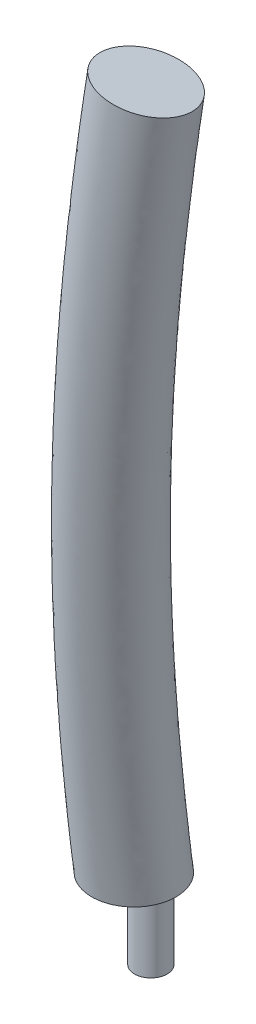
ISO-10303-21;
HEADER;
FILE_DESCRIPTION(('STEP AP214'),'2;1');
FILE_NAME('part.step','',(''),(''),'','','');
FILE_SCHEMA(('AUTOMOTIVE_DESIGN { 1 0 10303 214 1 1 1 1 }'));
ENDSEC;
DATA;
#1=APPLICATION_CONTEXT('core data for automotive mechanical design processes');
#2=APPLICATION_PROTOCOL_DEFINITION('international standard','automotive_design',2000,#1);
#3=PRODUCT_CONTEXT('',#1,'mechanical');
#4=PRODUCT('Part','Part','',(#3));
#5=PRODUCT_RELATED_PRODUCT_CATEGORY('part','',(#4));
#6=PRODUCT_DEFINITION_FORMATION('','',#4);
#7=PRODUCT_DEFINITION_CONTEXT('part definition',#1,'design');
#8=PRODUCT_DEFINITION('design','',#6,#7);
#9=PRODUCT_DEFINITION_SHAPE('','',#8);
#10=(LENGTH_UNIT() NAMED_UNIT(*) SI_UNIT(.MILLI.,.METRE.));
#11=(NAMED_UNIT(*) PLANE_ANGLE_UNIT() SI_UNIT($,.RADIAN.));
#12=(NAMED_UNIT(*) SI_UNIT($,.STERADIAN.) SOLID_ANGLE_UNIT());
#13=UNCERTAINTY_MEASURE_WITH_UNIT(LENGTH_MEASURE(1.E-05),#10,'distance_accuracy_value','');
#14=(GEOMETRIC_REPRESENTATION_CONTEXT(3) GLOBAL_UNCERTAINTY_ASSIGNED_CONTEXT((#13)) GLOBAL_UNIT_ASSIGNED_CONTEXT((#10,
#11,#12)) REPRESENTATION_CONTEXT('',''));
#15=CARTESIAN_POINT('',(0.,0.,0.));
#16=DIRECTION('',(0.,0.,1.));
#17=DIRECTION('',(1.,0.,0.));
#18=AXIS2_PLACEMENT_3D('',#15,#16,#17);
#19=CARTESIAN_POINT('',(0.,0.,0.));
#20=DIRECTION('',(0.,1.,0.));
#21=DIRECTION('',(0.,0.,1.));
#22=AXIS2_PLACEMENT_3D('',#19,#20,#21);
#23=PLANE('',#22);
#24=CARTESIAN_POINT('',(-0.956231117249,0.,0.));
#25=DIRECTION('',(0.,-1.,0.));
#26=DIRECTION('',(0.,0.,-1.));
#27=AXIS2_PLACEMENT_3D('',#24,#25,#26);
#28=CIRCLE('',#27,0.193254320975);
#29=CARTESIAN_POINT('',(-0.956231117249,0.,-0.193254320975));
#30=VERTEX_POINT('',#29);
#31=EDGE_CURVE('E17',#30,#30,#28,.F.);
#32=ORIENTED_EDGE('',*,*,#31,.F.);
#33=EDGE_LOOP('',(#32));
#34=FACE_BOUND('',#33,.T.);
#35=ADVANCED_FACE('F14',(#34),#23,.F.);
#36=CARTESIAN_POINT('',(-0.956231117249,0.5,0.));
#37=DIRECTION('',(0.,-1.,0.));
#38=DIRECTION('',(0.,0.,-1.));
#39=AXIS2_PLACEMENT_3D('',#36,#37,#38);
#40=CYLINDRICAL_SURFACE('',#39,0.193254320975);
#41=ORIENTED_EDGE('',*,*,#31,.T.);
#42=EDGE_LOOP('',(#41));
#43=FACE_BOUND('',#42,.T.);
#44=CARTESIAN_POINT('',(-0.956231117249,1.,0.));
#45=DIRECTION('',(0.,-1.,0.));
#46=DIRECTION('',(0.,0.,-1.));
#47=AXIS2_PLACEMENT_3D('',#44,#45,#46);
#48=CIRCLE('',#47,0.193254320975);
#49=CARTESIAN_POINT('',(-0.956231117249,1.,-0.193254320975));
#50=VERTEX_POINT('',#49);
#51=EDGE_CURVE('E26',#50,#50,#48,.F.);
#52=ORIENTED_EDGE('',*,*,#51,.F.);
#53=EDGE_LOOP('',(#52));
#54=FACE_BOUND('',#53,.T.);
#55=ADVANCED_FACE('F48',(#43,#54),#40,.T.);
#56=CARTESIAN_POINT('',(0.987813341373,9.84483464318,0.987813341373));
#57=DIRECTION('',(0.151428996103013,0.976213588915081,-0.155165356819013));
#58=DIRECTION('',(0.,0.156975577572689,0.987602484831686));
#59=AXIS2_PLACEMENT_3D('',#56,#57,#58);
#60=PLANE('',#59);
#61=CARTESIAN_POINT('',(-0.506269104120293,10.0795245649109,1.00624584472));
#62=CARTESIAN_POINT('',(-0.50525709340251,10.0837746752037,1.03397280180204));
#63=CARTESIAN_POINT('',(-0.501905322690594,10.0876612581941,1.06169606743318));
#64=CARTESIAN_POINT('',(-0.490597271185495,10.0945934061919,1.11634501831403));
#65=CARTESIAN_POINT('',(-0.482631140404831,10.0976371514384,1.14326886744751));
#66=CARTESIAN_POINT('',(-0.462326759081781,10.1027861218031,1.19547876200942));
#67=CARTESIAN_POINT('',(-0.449993342779399,10.1048923788518,1.22076658193472));
#68=CARTESIAN_POINT('',(-0.421301348827602,10.1081108236333,1.26901632997523));
#69=CARTESIAN_POINT('',(-0.404942493194331,10.1092229426895,1.29197809730611));
#70=CARTESIAN_POINT('',(-0.368666057064492,10.1104214541724,1.33492136530169));
#71=CARTESIAN_POINT('',(-0.348748752785155,10.1105079261777,1.35490309706479));
#72=CARTESIAN_POINT('',(-0.305917965690478,10.1096527978068,1.39132253547263));
#73=CARTESIAN_POINT('',(-0.283004225010662,10.1087111088987,1.4077599367799));
#74=CARTESIAN_POINT('',(-0.23484905988521,10.1058272705044,1.43661203480354));
#75=CARTESIAN_POINT('',(-0.209609239353526,10.103885806223,1.44902947715343));
#76=CARTESIAN_POINT('',(-0.157470471247561,10.0990547119404,1.4695182092012));
#77=CARTESIAN_POINT('',(-0.130569435498034,10.09616386801,1.47758389942812));
#78=CARTESIAN_POINT('',(-0.075919911670599,10.0895190057408,1.48911171546231));
#79=CARTESIAN_POINT('',(-0.0481719778705382,10.0857655418923,1.49257678888084));
#80=CARTESIAN_POINT('',(0.00740017111468766,10.077500965996,1.4948146816877));
#81=CARTESIAN_POINT('',(0.0352243862998527,10.0729898539483,1.49358750107603));
#82=CARTESIAN_POINT('',(0.0901769699684104,10.0633349158256,1.4864733665795));
#83=CARTESIAN_POINT('',(0.117304880674404,10.0581906857711,1.48058342432789));
#84=CARTESIAN_POINT('',(0.170041156229029,10.0474249788954,1.46431801475568));
#85=CARTESIAN_POINT('',(0.195651424579908,10.0418041223692,1.45394830765109));
#86=CARTESIAN_POINT('',(0.244681056064473,10.0302348373514,1.42900984552715));
#87=CARTESIAN_POINT('',(0.268098906595312,10.0242861871368,1.41443821937201));
#88=CARTESIAN_POINT('',(0.31205700848417,10.0122342501329,1.38151377322076));
#89=CARTESIAN_POINT('',(0.332597507448084,10.0061309767028,1.36316127891744));
#90=CARTESIAN_POINT('',(0.370221809945408,9.99394209910666,1.32319399681458));
#91=CARTESIAN_POINT('',(0.38730534513196,9.98785649634836,1.30157895598704));
#92=CARTESIAN_POINT('',(0.417527550167774,9.97587645285048,1.2557016852502));
#93=CARTESIAN_POINT('',(0.430666492412865,9.96998199893612,1.23143963828907));
#94=CARTESIAN_POINT('',(0.45264073475683,9.95854543846847,1.18093230570306));
#95=CARTESIAN_POINT('',(0.461471264598988,9.95300372834576,1.15468485880783));
#96=CARTESIAN_POINT('',(0.474540199562531,9.94244628496941,1.10101757021112));
#97=CARTESIAN_POINT('',(0.478788382122994,9.93742945252613,1.07360035502316));
#98=CARTESIAN_POINT('',(0.481895107861783,9.92981557826982,1.02873003537062));
#99=CARTESIAN_POINT('',(0.482176939405304,9.92701634787256,1.01139388930047));
#100=CARTESIAN_POINT('',(0.480532226535982,9.92010909781028,0.966332229014104));
#101=CARTESIAN_POINT('',(0.477180455823266,9.91622251481328,0.938608963385447));
#102=CARTESIAN_POINT('',(0.465872404318256,9.90929036680849,0.883960012508368));
#103=CARTESIAN_POINT('',(0.457906273538485,9.90624662156164,0.857036163376173));
#104=CARTESIAN_POINT('',(0.437601892217198,9.90109765119881,0.80482626881508));
#105=CARTESIAN_POINT('',(0.425268475915477,9.8989913941524,0.77953844888939));
#106=CARTESIAN_POINT('',(0.39657648196469,9.89577294937019,0.731288700848503));
#107=CARTESIAN_POINT('',(0.380217626331769,9.89466083031093,0.70832693351765));
#108=CARTESIAN_POINT('',(0.34394119020289,9.8934623188279,0.665383665521496));
#109=CARTESIAN_POINT('',(0.32402388592415,9.89337584682547,0.64540193375782));
#110=CARTESIAN_POINT('',(0.281193098830252,9.89423097519625,0.608982495349012));
#111=CARTESIAN_POINT('',(0.25827935815062,9.89517266410126,0.592545094041355));
#112=CARTESIAN_POINT('',(0.210124193025666,9.89805650249399,0.563692996017038));
#113=CARTESIAN_POINT('',(0.184884372494304,9.89999796677684,0.551275553666846));
#114=CARTESIAN_POINT('',(0.132745604389481,9.90482906106448,0.530786821617756));
#115=CARTESIAN_POINT('',(0.105844568640773,9.90771990499846,0.522721131389812));
#116=CARTESIAN_POINT('',(0.0511950448132515,9.91436476726501,0.511193315354821));
#117=CARTESIAN_POINT('',(0.0234471110122845,9.91811823110735,0.507728241936511));
#118=CARTESIAN_POINT('',(-0.0321250379722217,9.92638280700806,0.505490349128424));
#119=CARTESIAN_POINT('',(-0.0599492531557611,9.93089391906643,0.506717529738663));
#120=CARTESIAN_POINT('',(-0.114901836824588,9.94054885718946,0.513831664233739));
#121=CARTESIAN_POINT('',(-0.142029747532483,9.94569308723355,0.519721606485313));
#122=CARTESIAN_POINT('',(-0.194766023088577,9.95645879410255,0.535987016056502));
#123=CARTESIAN_POINT('',(-0.220376291439029,9.96207965063232,0.54635672316012));
#124=CARTESIAN_POINT('',(-0.269405922924264,9.97364893565031,0.571295185282946));
#125=CARTESIAN_POINT('',(-0.292823773456187,9.97959758586141,0.58586681143797));
#126=CARTESIAN_POINT('',(-0.336781875344623,9.99164952287107,0.618791257588092));
#127=CARTESIAN_POINT('',(-0.357322374307014,9.99775279631034,0.637143751890425));
#128=CARTESIAN_POINT('',(-0.394946676804651,10.0099416739087,0.677111033992359));
#129=CARTESIAN_POINT('',(-0.412030211993101,10.01602727666,0.698726074819915));
#130=CARTESIAN_POINT('',(-0.442252417032758,10.0280073201433,0.744603345557151));
#131=CARTESIAN_POINT('',(-0.455391359279814,10.0339017740501,0.768865392518664));
#132=CARTESIAN_POINT('',(-0.477365601623999,10.0453383345206,0.819372725103027));
#133=CARTESIAN_POINT('',(-0.486196131464399,10.0508800446539,0.845620171996235));
#134=CARTESIAN_POINT('',(-0.499265066428323,10.0614374880328,0.899287460591758));
#135=CARTESIAN_POINT('',(-0.503513248990902,10.0664543204681,0.926704675780543));
#136=CARTESIAN_POINT('',(-0.506619974730393,10.0740681947304,0.971574995436586));
#137=CARTESIAN_POINT('',(-0.506901806273137,10.0768674251347,0.988911141510456));
#138=CARTESIAN_POINT('',(-0.506269104120293,10.0795245649109,1.00624584472));
#139=B_SPLINE_CURVE_WITH_KNOTS('',3,(#61,#62,#63,#64,#65,#66,#67,#68,#69,#70,#71,#72,#73,#74,
#75,#76,#77,#78,#79,#80,#81,#82,#83,#84,#85,#86,#87,#88,#89,#90,#91,#92,#93,#94,#95,#96,#97,#98,
#99,#100,#101,#102,#103,#104,#105,#106,#107,#108,#109,#110,#111,#112,#113,#114,#115,#116,#117,
#118,#119,#120,#121,#122,#123,#124,#125,#126,#127,#128,#129,#130,#131,#132,#133,#134,#135,#136,
#137,#138),.UNSPECIFIED.,.T.,.F.,(4,2,2,2,2,2,2,2,2,2,2,2,2,2,2,2,2,2,2,2,2,2,2,2,2,2,2,2,2,2,2,
2,2,2,2,2,2,2,4),(0.,0.084152148870189,0.168484597574565,0.252723987239359,0.336969195838055,
0.421207867915281,0.505453794100608,0.589642058291817,0.67393839211691,0.758180691248436,
0.842422990379918,0.926719324204546,1.01090758839494,1.09515351457959,1.17939218665619,
1.26363739525452,1.34787678491919,1.43220923362316,1.5163613824929,1.56897272820956,
1.6531248770755,1.73745732577559,1.82169671544011,1.90594192403847,1.99018059611566,
2.07442652230093,2.15861478649186,2.24291112031674,2.3271534194482,2.41139571857994,
2.49569205240445,2.57988031659464,2.66412624277955,2.74836491485688,2.8326101234544,
2.9168495131178,3.00118196182071,3.08533411068968,3.13794545642062),.UNSPECIFIED.);
#140=CARTESIAN_POINT('',(-0.506269104122,10.0795245649,1.00624584472));
#141=VERTEX_POINT('',#140);
#142=EDGE_CURVE('E21',#141,#141,#139,.T.);
#143=ORIENTED_EDGE('',*,*,#142,.T.);
#144=EDGE_LOOP('',(#143));
#145=FACE_BOUND('',#144,.T.);
#146=ADVANCED_FACE('F44',(#145),#60,.T.);
#147=CARTESIAN_POINT('',(0.,1.,0.));
#148=DIRECTION('',(0.,-1.,0.));
#149=DIRECTION('',(0.,0.,-1.));
#150=AXIS2_PLACEMENT_3D('',#147,#148,#149);
#151=PLANE('',#150);
#152=ORIENTED_EDGE('',*,*,#51,.T.);
#153=EDGE_LOOP('',(#152));
#154=FACE_BOUND('',#153,.T.);
#155=CARTESIAN_POINT('',(-0.500063792392386,1.,0.156495237907994));
#156=CARTESIAN_POINT('',(-0.499964092722663,0.999999999999976,0.18446961687893));
#157=CARTESIAN_POINT('',(-0.502218124597925,0.999999999999994,0.212477196711852));
#158=CARTESIAN_POINT('',(-0.511398700835471,1.00000000000001,0.267763963409385));
#159=CARTESIAN_POINT('',(-0.518335058433767,1.,0.29504149515756));
#160=CARTESIAN_POINT('',(-0.536688302820686,0.999999999999998,0.348019028348391));
#161=CARTESIAN_POINT('',(-0.548100821282103,0.999999999999999,0.373720539651723));
#162=CARTESIAN_POINT('',(-0.5750877331684,1.,0.422838142270073));
#163=CARTESIAN_POINT('',(-0.590662359241977,1.,0.44625410573025));
#164=CARTESIAN_POINT('',(-0.62549653208291,1.,0.490088451057401));
#165=CARTESIAN_POINT('',(-0.644748895736187,1.,0.51051254128367));
#166=CARTESIAN_POINT('',(-0.686411846898635,1.,0.547838750571105));
#167=CARTESIAN_POINT('',(-0.708822684078854,1.,0.564740590943379));
#168=CARTESIAN_POINT('',(-0.756139433199164,1.,0.59452909088248));
#169=CARTESIAN_POINT('',(-0.781042895467915,1.,0.607419642389927));
#170=CARTESIAN_POINT('',(-0.832689487560758,1.,0.628863189870545));
#171=CARTESIAN_POINT('',(-0.859434949898552,1.,0.637410567014796));
#172=CARTESIAN_POINT('',(-0.914018334771212,1.,0.649918011371834));
#173=CARTESIAN_POINT('',(-0.941857786416347,1.,0.653871403218605));
#174=CARTESIAN_POINT('',(-0.997805942592464,1.,0.657065886838705));
#175=CARTESIAN_POINT('',(-1.02591465545667,1.,0.656306832295428));
#176=CARTESIAN_POINT('',(-1.08172666228852,1.,0.650093123983146));
#177=CARTESIAN_POINT('',(-1.10942778353882,1.,0.644618951589503));
#178=CARTESIAN_POINT('',(-1.16348825749314,1.,0.629120934135889));
#179=CARTESIAN_POINT('',(-1.18984924765899,1.,0.619102797394727));
#180=CARTESIAN_POINT('',(-1.24063196895963,1.,0.59475538200515));
#181=CARTESIAN_POINT('',(-1.26504533524411,1.,0.580408653460771));
#182=CARTESIAN_POINT('',(-1.31112099214897,1.,0.547828532268963));
#183=CARTESIAN_POINT('',(-1.33278348224804,1.,0.529595421698079));
#184=CARTESIAN_POINT('',(-1.37278551095059,1.,0.489719421109249));
#185=CARTESIAN_POINT('',(-1.39111864446253,1.,0.468070105303021));
#186=CARTESIAN_POINT('',(-1.42388664635885,1.,0.422000296948663));
#187=CARTESIAN_POINT('',(-1.43832181731918,1.,0.397580019703114));
#188=CARTESIAN_POINT('',(-1.46288793028224,1.,0.346647994246149));
#189=CARTESIAN_POINT('',(-1.47301633049206,1.,0.320135021869273));
#190=CARTESIAN_POINT('',(-1.48864241278729,1.,0.265826148502597));
#191=CARTESIAN_POINT('',(-1.49415002387603,1.,0.238033134389059));
#192=CARTESIAN_POINT('',(-1.49926731618958,1.,0.192190935040841));
#193=CARTESIAN_POINT('',(-1.5002954624244,1.,0.174285016013917));
#194=CARTESIAN_POINT('',(-1.50045530496553,1.,0.12838710506197));
#195=CARTESIAN_POINT('',(-1.49819845042228,1.,0.100375684232301));
#196=CARTESIAN_POINT('',(-1.48901157910557,0.999999999999999,0.0450817654912083));
#197=CARTESIAN_POINT('',(-1.48207174987181,0.999999999999997,0.0178009234407708));
#198=CARTESIAN_POINT('',(-1.46371123762733,1.,-0.0351825971497945));
#199=CARTESIAN_POINT('',(-1.45229493257417,1.00000000000002,-0.0608867893232305));
#200=CARTESIAN_POINT('',(-1.42530020324208,0.999999999999985,-0.110009180297386));
#201=CARTESIAN_POINT('',(-1.40972154742945,0.999999999999944,-0.133427251832058));
#202=CARTESIAN_POINT('',(-1.37487844362363,0.999999999999944,-0.177265782154243));
#203=CARTESIAN_POINT('',(-1.35562106308854,0.999999999999985,-0.197691858246147));
#204=CARTESIAN_POINT('',(-1.31394747322588,1.00000000000001,-0.235020729679293));
#205=CARTESIAN_POINT('',(-1.29153101616996,1.,-0.251923248452384));
#206=CARTESIAN_POINT('',(-1.24420519852408,0.999999999999995,-0.281709604820903));
#207=CARTESIAN_POINT('',(-1.21929857103168,0.999999999999999,-0.29459778577673));
#208=CARTESIAN_POINT('',(-1.16764582727807,1.,-0.316035280584355));
#209=CARTESIAN_POINT('',(-1.14089738048548,1.,-0.324578978219597));
#210=CARTESIAN_POINT('',(-1.08631312204434,0.999999999999999,-0.337076474504025));
#211=CARTESIAN_POINT('',(-1.05847595913246,1.,-0.341024369323054));
#212=CARTESIAN_POINT('',(-1.00253327932469,1.,-0.34420796773303));
#213=CARTESIAN_POINT('',(-0.974427754175864,1.,-0.343443525936721));
#214=CARTESIAN_POINT('',(-0.91862490875116,1.,-0.3372196614182));
#215=CARTESIAN_POINT('',(-0.89092973001274,0.999999999999999,-0.331741035585162));
#216=CARTESIAN_POINT('',(-0.836881613766953,1.,-0.316235620186319));
#217=CARTESIAN_POINT('',(-0.810527039727506,1.00000000000001,-0.30621453156813));
#218=CARTESIAN_POINT('',(-0.759754671411834,1.00000000000001,-0.281861918381664));
#219=CARTESIAN_POINT('',(-0.735345441298091,1.,-0.267512535716067));
#220=CARTESIAN_POINT('',(-0.68927788396304,0.999999999999999,-0.234928504021753));
#221=CARTESIAN_POINT('',(-0.667619359857456,1.,-0.216694133315007));
#222=CARTESIAN_POINT('',(-0.627621129083839,1.,-0.176813636011475));
#223=CARTESIAN_POINT('',(-0.609288400497934,0.999999999999999,-0.155160510212538));
#224=CARTESIAN_POINT('',(-0.576521460918959,1.,-0.109083426463763));
#225=CARTESIAN_POINT('',(-0.562086948288173,1.00000000000001,-0.084659683107678));
#226=CARTESIAN_POINT('',(-0.537521384647712,0.999999999999996,-0.0337188314003453));
#227=CARTESIAN_POINT('',(-0.527393240621424,0.999999999999982,-0.00720032326721057));
#228=CARTESIAN_POINT('',(-0.511769030619192,1.00000000000002,0.0471195570314643));
#229=CARTESIAN_POINT('',(-0.506263018951543,1.00000000000007,0.0749180382449277));
#230=CARTESIAN_POINT('',(-0.50115364315706,1.00000000000005,0.120733900476023));
#231=CARTESIAN_POINT('',(-0.5001275426353,1.00000000000002,0.138607781914407));
#232=CARTESIAN_POINT('',(-0.500063792392386,1.,0.156495237907994));
#233=B_SPLINE_CURVE_WITH_KNOTS('',3,(#155,#156,#157,#158,#159,#160,#161,#162,#163,#164,#165,
#166,#167,#168,#169,#170,#171,#172,#173,#174,#175,#176,#177,#178,#179,#180,#181,#182,#183,#184,
#185,#186,#187,#188,#189,#190,#191,#192,#193,#194,#195,#196,#197,#198,#199,#200,#201,#202,#203,
#204,#205,#206,#207,#208,#209,#210,#211,#212,#213,#214,#215,#216,#217,#218,#219,#220,#221,#222,
#223,#224,#225,#226,#227,#228,#229,#230,#231,#232),.UNSPECIFIED.,.T.,.F.,(4,2,2,2,2,2,2,2,2,2,2,
2,2,2,2,2,2,2,2,2,2,2,2,2,2,2,2,2,2,2,2,2,2,2,2,2,2,2,4),(0.,0.0838675667695713,
0.167911451473621,0.251873520233152,0.335840283189685,0.419644694271397,0.503455733644529,
0.587185200228178,0.671022714817039,0.754981899155549,0.838943690353308,0.923254728005536,
1.00746014269028,1.09200965707312,1.17655303687665,1.2612573788517,1.34595514383461,
1.4307028270478,1.51526793734316,1.56899054185361,1.65287025278294,1.73692626888239,
1.82090028308731,1.90487896937897,1.98869791197519,2.07252343114356,2.15625793669353,
2.24010041438028,2.3240504788018,2.40800313330365,2.49229939456676,2.57649015278,
2.6610331384544,2.74557006947356,2.83028237202893,2.91498811780248,2.99975095315209,
3.08433092879582,3.13795776395947),.UNSPECIFIED.);
#234=CARTESIAN_POINT('',(-1.50035786804304,1.,0.156365584134835));
#235=VERTEX_POINT('',#234);
#236=EDGE_CURVE('E10',#235,#235,#233,.T.);
#237=ORIENTED_EDGE('',*,*,#236,.T.);
#238=EDGE_LOOP('',(#237));
#239=FACE_BOUND('',#238,.T.);
#240=ADVANCED_FACE('F41',(#154,#239),#151,.T.);
#241=CARTESIAN_POINT('',(-1.51251494884,0.,0.));
#242=CARTESIAN_POINT('',(-1.51251494884,0.,2.));
#243=CARTESIAN_POINT('',(0.487485051155,0.,1.));
#244=CARTESIAN_POINT('',(0.487485051155,0.,-1.));
#245=CARTESIAN_POINT('',(-1.51251494884,0.,-2.));
#246=CARTESIAN_POINT('',(-1.51251494884,0.,0.));
#247=CARTESIAN_POINT('',(-1.51251494889,2.0317842466,0.319151941971));
#248=CARTESIAN_POINT('',(-1.49733205582,2.03178424642,2.31915194198));
#249=CARTESIAN_POINT('',(0.49507649767,1.93512693964,1.30396904658));
#250=CARTESIAN_POINT('',(0.47989360455,1.93512693982,-0.696030953631));
#251=CARTESIAN_POINT('',(-1.52769784196,2.03178424679,-1.68084805825));
#252=CARTESIAN_POINT('',(-1.51251494889,2.0317842466,0.319151941971));
#253=CARTESIAN_POINT('',(-1.38674469461,4.06368746816,0.637546559239));
#254=CARTESIAN_POINT('',(-1.35933398124,4.1008606035,2.6374023603));
#255=CARTESIAN_POINT('',(0.620977483951,3.88849514312,1.61006387781));
#256=CARTESIAN_POINT('',(0.59356674387,3.85132200801,-0.38979185493));
#257=CARTESIAN_POINT('',(-1.41415540798,4.02651433282,-1.36230930453));
#258=CARTESIAN_POINT('',(-1.38674469461,4.06368746816,0.637546559239));
#259=CARTESIAN_POINT('',(-1.13593463826,6.07089006325,0.883712551017));
#260=CARTESIAN_POINT('',(-1.09683778803,6.18352425452,2.88368691819));
#261=CARTESIAN_POINT('',(0.865437774574,5.85656395609,1.85643064268));
#262=CARTESIAN_POINT('',(0.826341012838,5.74392955196,-0.143543697606));
#263=CARTESIAN_POINT('',(-1.17503148848,5.95825565912,-1.11626189048));
#264=CARTESIAN_POINT('',(-1.13593463826,6.07089006325,0.883712551017));
#265=CARTESIAN_POINT('',(-0.820355032055,8.07999156209,1.00624584507));
#266=CARTESIAN_POINT('',(-0.763348601026,8.28774042502,2.99699654644));
#267=CARTESIAN_POINT('',(1.18395917747,7.87470864184,1.97724787699));
#268=CARTESIAN_POINT('',(1.12695274663,7.66695977813,-0.0135028241352));
#269=CARTESIAN_POINT('',(-0.877361463084,7.87224269837,-0.984504856006));
#270=CARTESIAN_POINT('',(-0.820355032055,8.07999156209,1.00624584507));
#271=CARTESIAN_POINT('',(-0.506269104122,10.0795245649,1.00624584472));
#272=CARTESIAN_POINT('',(-0.434322964699,10.3823825571,2.98187252747));
#273=CARTESIAN_POINT('',(1.50533064834,9.92062284738,1.96968586884));
#274=CARTESIAN_POINT('',(1.43338450891,9.61776485517,-0.00594081390411));
#275=CARTESIAN_POINT('',(-0.578215243546,9.77666657271,-0.969380838024));
#276=CARTESIAN_POINT('',(-0.506269104122,10.0795245649,1.00624584472));
#277=(BOUNDED_SURFACE() B_SPLINE_SURFACE(5,5,((#241,#242,#243,#244,#245,#246),(#247,#248,#249,
#250,#251,#252),(#253,#254,#255,#256,#257,#258),(#259,#260,#261,#262,#263,#264),(#265,#266,#267,
#268,#269,#270),(#271,#272,#273,#274,#275,#276)),.UNSPECIFIED.,.F.,.T.,
.F.) B_SPLINE_SURFACE_WITH_KNOTS((6,6),(6,6),(0.,10.1231631988),(0.,3.14159265359),
.UNSPECIFIED.) GEOMETRIC_REPRESENTATION_ITEM() RATIONAL_B_SPLINE_SURFACE(((1.,0.2,0.2,0.2,0.2,
1.),(1.,0.2,0.2,0.2,0.2,1.),(1.,0.2,0.2,0.2,0.2,1.),(1.,0.2,0.2,0.2,0.2,1.),(1.,0.2,0.2,0.2,0.2,
1.),(1.,0.2,0.2,0.2,0.2,1.))) REPRESENTATION_ITEM('') SURFACE());
#278=CARTESIAN_POINT('',(-0.506269104122,10.0795245649,1.00624584472));
#279=CARTESIAN_POINT('',(-0.513644104427612,10.0325738653094,1.0062458579871));
#280=CARTESIAN_POINT('',(-0.521019096329752,9.98562316471529,1.00616477481288));
#281=CARTESIAN_POINT('',(-0.535767358841188,9.89170971208878,1.00584053877489));
#282=CARTESIAN_POINT('',(-0.543140628523684,9.8447469600543,1.00559734434351));
#283=CARTESIAN_POINT('',(-0.557881756969704,9.75080995815034,1.00494892986682));
#284=CARTESIAN_POINT('',(-0.565249613969201,9.70383570827744,1.00454367021573));
#285=CARTESIAN_POINT('',(-0.579976240992212,9.60987620835803,1.00357127060141));
#286=CARTESIAN_POINT('',(-0.587335008489031,9.5628909583069,1.00300409282025));
#287=CARTESIAN_POINT('',(-0.602039792891113,9.46890990167929,1.00170807765935));
#288=CARTESIAN_POINT('',(-0.609385806568844,9.4219140950971,1.00097920407453));
#289=CARTESIAN_POINT('',(-0.624061433982749,9.3279123170431,0.99936009943187));
#290=CARTESIAN_POINT('',(-0.631391043841002,9.2809063455646,0.998469833614082));
#291=CARTESIAN_POINT('',(-0.646030229563654,9.18688457932262,0.996528325514866));
#292=CARTESIAN_POINT('',(-0.653339800939237,9.13986878455152,0.995477049756574));
#293=CARTESIAN_POINT('',(-0.667935292185584,9.0458276652844,0.993213981426785));
#294=CARTESIAN_POINT('',(-0.675221206985852,8.9988023407799,0.992002156506081));
#295=CARTESIAN_POINT('',(-0.689765785298082,8.90474240954662,0.989418527287112));
#296=CARTESIAN_POINT('',(-0.69702444317743,8.85770780280854,0.98804669161871));
#297=CARTESIAN_POINT('',(-0.71151092679254,8.76362951053487,0.985143655433225));
#298=CARTESIAN_POINT('',(-0.718738746344129,8.71658582498919,0.983612424383702));
#299=CARTESIAN_POINT('',(-0.733159992572662,8.62248953643864,0.980391288321769));
#300=CARTESIAN_POINT('',(-0.740353412516071,8.5754369334229,0.978701353480745));
#301=CARTESIAN_POINT('',(-0.754702320117854,8.48132293116761,0.975163576353721));
#302=CARTESIAN_POINT('',(-0.761857800487821,8.4342615319164,0.973315704816839));
#303=CARTESIAN_POINT('',(-0.776127312048503,8.34013002030803,0.969462895719885));
#304=CARTESIAN_POINT('',(-0.783241335383381,8.29305990793842,0.967457929368587));
#305=CARTESIAN_POINT('',(-0.797424439690759,8.19891101707907,0.963291846240863));
#306=CARTESIAN_POINT('',(-0.804493512221045,8.15183223857609,0.961130701023006));
#307=CARTESIAN_POINT('',(-0.818583246641437,8.05766602828922,0.956653249208468));
#308=CARTESIAN_POINT('',(-0.825603899478287,8.01057859649127,0.954336914418687));
#309=CARTESIAN_POINT('',(-0.839593352332896,7.9163950602926,0.949550145226721));
#310=CARTESIAN_POINT('',(-0.846562142656638,7.86929895587698,0.947079682786833));
#311=CARTESIAN_POINT('',(-0.860444455597914,7.77509802494545,0.941985792052915));
#312=CARTESIAN_POINT('',(-0.867357967846565,7.72799319841377,0.939362335792285));
#313=CARTESIAN_POINT('',(-0.881126338234568,7.63377474556242,0.933963662438623));
#314=CARTESIAN_POINT('',(-0.88798118529234,7.5866611192261,0.931188417374519));
#315=CARTESIAN_POINT('',(-0.901628868571091,7.49242496287304,0.925487441970693));
#316=CARTESIAN_POINT('',(-0.908421692956913,7.44530243283876,0.922561683588609));
#317=CARTESIAN_POINT('',(-0.921942005030754,7.35104834097812,0.916561026912198));
#318=CARTESIAN_POINT('',(-0.928669480086768,7.3039167791333,0.913486100446168));
#319=CARTESIAN_POINT('',(-0.942055799696713,7.20964447330613,0.907188522043371));
#320=CARTESIAN_POINT('',(-0.948714630776787,7.1625037293044,0.903965841756257));
#321=CARTESIAN_POINT('',(-0.961960401876871,7.06821288856964,0.8973742385025));
#322=CARTESIAN_POINT('',(-0.968547327535095,7.02106279181631,0.894005286966261));
#323=CARTESIAN_POINT('',(-0.98164606166872,6.92675305672172,0.887122691626806));
#324=CARTESIAN_POINT('',(-0.988157854847905,6.87959341835926,0.883609019002745));
#325=CARTESIAN_POINT('',(-1.00110313352419,6.78526439491239,0.876438598793281));
#326=CARTESIAN_POINT('',(-1.00753660274435,6.7380950098059,0.87278182211228));
#327=CARTESIAN_POINT('',(-1.02032207981445,6.64374627344501,0.865326877259511));
#328=CARTESIAN_POINT('',(-1.02667407036131,6.5965669221677,0.861528679702233));
#329=CARTESIAN_POINT('',(-1.03929347439479,6.50219802173273,0.853792642004458));
#330=CARTESIAN_POINT('',(-1.04556086950821,6.45500847255139,0.849854772181543));
#331=CARTESIAN_POINT('',(-1.05800800616937,6.36061893425492,0.841841203569224));
#332=CARTESIAN_POINT('',(-1.06418772823188,6.31341894511539,0.837765474801461));
#333=CARTESIAN_POINT('',(-1.07645648265603,6.21900827651354,0.829478065897787));
#334=CARTESIAN_POINT('',(-1.08254549438125,6.17179759702621,0.825266355496265));
#335=CARTESIAN_POINT('',(-1.09462983355112,6.07736529098963,0.816708924177705));
#336=CARTESIAN_POINT('',(-1.10062513917223,6.03014366441488,0.812363172723947));
#337=CARTESIAN_POINT('',(-1.11251911429425,5.9356892030997,0.8035396626808));
#338=CARTESIAN_POINT('',(-1.1184177607524,5.88845636833341,0.799061873306881));
#339=CARTESIAN_POINT('',(-1.130115509633,5.79397922715216,0.789976352603811));
#340=CARTESIAN_POINT('',(-1.1359145877658,5.74673492071113,0.785368590272456));
#341=CARTESIAN_POINT('',(-1.14741033718778,5.6522345723037,0.776025249909023));
#342=CARTESIAN_POINT('',(-1.15310698291765,5.60497853031118,0.771289640693689));
#343=CARTESIAN_POINT('',(-1.16439505101643,5.51045444851575,0.761692793164873));
#344=CARTESIAN_POINT('',(-1.16998644653907,5.46318640868687,0.75683152352981));
#345=CARTESIAN_POINT('',(-1.18106124517905,5.36863807251085,0.746985601386526));
#346=CARTESIAN_POINT('',(-1.18654462015179,5.3213577761381,0.742000917466829));
#347=CARTESIAN_POINT('',(-1.1974006573026,5.22678467372908,0.731910471876433));
#348=CARTESIAN_POINT('',(-1.20277329003283,5.17949186766777,0.726804678758069));
#349=CARTESIAN_POINT('',(-1.21340517214565,5.0848935002844,0.716474378064855));
#350=CARTESIAN_POINT('',(-1.21866439077912,5.03758793893814,0.711249839064682));
#351=CARTESIAN_POINT('',(-1.22906682516299,4.94296382492112,0.700684467350378));
#352=CARTESIAN_POINT('',(-1.23421000887223,4.89564527222724,0.695343603296141));
#353=CARTESIAN_POINT('',(-1.24437780607029,4.80099495097018,0.68454805894039));
#354=CARTESIAN_POINT('',(-1.2494023862429,4.75366318238524,0.679093347450707));
#355=CARTESIAN_POINT('',(-1.2593304624087,4.65898621830562,0.66807264169154));
#356=CARTESIAN_POINT('',(-1.26423392383571,4.6116410227908,0.662506616455876));
#357=CARTESIAN_POINT('',(-1.27391730310947,4.51693700930085,0.651265871950184));
#358=CARTESIAN_POINT('',(-1.2786971851736,4.46957819130747,0.645591122008802));
#359=CARTESIAN_POINT('',(-1.28813100205848,4.37484675478508,0.634135571392794));
#360=CARTESIAN_POINT('',(-1.29278489992248,4.32747413623999,0.628354740416703));
#361=CARTESIAN_POINT('',(-1.30196440166083,4.2327149399996,0.616689724866359));
#362=CARTESIAN_POINT('',(-1.30648996745569,4.18532836229065,0.61080551043724));
#363=CARTESIAN_POINT('',(-1.31541051640532,4.09054111055414,0.598936478228755));
#364=CARTESIAN_POINT('',(-1.31980546041855,4.04314043651562,0.592951631118879));
#365=CARTESIAN_POINT('',(-1.32846253642897,3.9483248783832,0.580884136189102));
#366=CARTESIAN_POINT('',(-1.33272462829284,3.90090999428126,0.574801459641239));
#367=CARTESIAN_POINT('',(-1.34111383108147,3.80606592770233,0.5625411601481));
#368=CARTESIAN_POINT('',(-1.34524090096121,3.75863674522043,0.55636350915541));
#369=CARTESIAN_POINT('',(-1.35335795248964,3.66376402096444,0.543916166038344));
#370=CARTESIAN_POINT('',(-1.35734789227162,3.61632047918877,0.53764644662426));
#371=CARTESIAN_POINT('',(-1.36518863912181,3.5214190048161,0.525017922164622));
#372=CARTESIAN_POINT('',(-1.36903940360173,3.473961072221,0.518659090662726));
#373=CARTESIAN_POINT('',(-1.37659981935223,3.37903081605378,0.505855347044195));
#374=CARTESIAN_POINT('',(-1.38030942742325,3.33155849248715,0.499410409378078));
#375=CARTESIAN_POINT('',(-1.38758561502542,3.23659948758011,0.486437507247062));
#376=CARTESIAN_POINT('',(-1.39115215086629,3.18911280624886,0.47990951821018));
#377=CARTESIAN_POINT('',(-1.39814034502046,3.09412515436015,0.466773615236206));
#378=CARTESIAN_POINT('',(-1.40156195928363,3.04662418381556,0.460165677771725));
#379=CARTESIAN_POINT('',(-1.40825852881532,2.9516080593776,0.446873027207824));
#380=CARTESIAN_POINT('',(-1.41153343981501,2.90409290550077,0.440188291688455));
#381=CARTESIAN_POINT('',(-1.41793489005106,2.80904855959103,0.426745240931543));
#382=CARTESIAN_POINT('',(-1.42106138495134,2.76151936757824,0.419986904439373));
#383=CARTESIAN_POINT('',(-1.42716436009611,2.66644713189005,0.406399893590621));
#384=CARTESIAN_POINT('',(-1.4301407960989,2.61890408823819,0.399571199196934));
#385=CARTESIAN_POINT('',(-1.43594208161044,2.52380437905151,0.385846759622139));
#386=CARTESIAN_POINT('',(-1.4387668871436,2.47624771354346,0.37895099566724));
#387=CARTESIAN_POINT('',(-1.44426341210965,2.38112103569571,0.365095748557154));
#388=CARTESIAN_POINT('',(-1.44693508801473,2.33355102338572,0.358136247930131));
#389=CARTESIAN_POINT('',(-1.45212392752937,2.23839797424249,0.344156902860943));
#390=CARTESIAN_POINT('',(-1.45464104825033,2.19081493744155,0.337137042279656));
#391=CARTESIAN_POINT('',(-1.45951942578821,2.09563621086743,0.323040395772827));
#392=CARTESIAN_POINT('',(-1.46188064055674,2.04804052112872,0.315963595063001));
#393=CARTESIAN_POINT('',(-1.46644593035618,1.95283691145787,0.301756529147532));
#394=CARTESIAN_POINT('',(-1.46864996438919,1.90522899156192,0.294626250525192));
#395=CARTESIAN_POINT('',(-1.47289969380223,1.81000139756937,0.280315731290739));
#396=CARTESIAN_POINT('',(-1.47494534945417,1.76238172351015,0.273135478632124));
#397=CARTESIAN_POINT('',(-1.47887720141979,1.66713115238057,0.258728554816289));
#398=CARTESIAN_POINT('',(-1.48076335950322,1.6195002553482,0.251501872974485));
#399=CARTESIAN_POINT('',(-1.48437517456083,1.52422782665381,0.237005674422471));
#400=CARTESIAN_POINT('',(-1.48610079503878,1.47658629502975,0.229736148369633));
#401=CARTESIAN_POINT('',(-1.489390575058,1.3812932446742,0.215157884970382));
#402=CARTESIAN_POINT('',(-1.49095470008158,1.33364172597997,0.207849139591033));
#403=CARTESIAN_POINT('',(-1.4939206055843,1.23832941026913,0.19319609843448));
#404=CARTESIAN_POINT('',(-1.49532235377484,1.19066861328843,0.185851795888188));
#405=CARTESIAN_POINT('',(-1.49796272517889,1.09533851252741,0.171131345063471));
#406=CARTESIAN_POINT('',(-1.49920131859545,1.04766920878092,0.163755191221386));
#407=CARTESIAN_POINT('',(-1.50035786804304,1.,0.156365584134835));
#408=B_SPLINE_CURVE_WITH_KNOTS('',3,(#278,#279,#280,#281,#282,#283,#284,#285,#286,#287,#288,
#289,#290,#291,#292,#293,#294,#295,#296,#297,#298,#299,#300,#301,#302,#303,#304,#305,#306,#307,
#308,#309,#310,#311,#312,#313,#314,#315,#316,#317,#318,#319,#320,#321,#322,#323,#324,#325,#326,
#327,#328,#329,#330,#331,#332,#333,#334,#335,#336,#337,#338,#339,#340,#341,#342,#343,#344,#345,
#346,#347,#348,#349,#350,#351,#352,#353,#354,#355,#356,#357,#358,#359,#360,#361,#362,#363,#364,
#365,#366,#367,#368,#369,#370,#371,#372,#373,#374,#375,#376,#377,#378,#379,#380,#381,#382,#383,
#384,#385,#386,#387,#388,#389,#390,#391,#392,#393,#394,#395,#396,#397,#398,#399,#400,#401,#402,
#403,#404,#405,#406,#407),.UNSPECIFIED.,.F.,.F.,(4,2,2,2,2,2,2,2,2,2,2,2,2,2,2,2,2,2,2,2,2,2,2,
2,2,2,2,2,2,2,2,2,2,2,2,2,2,2,2,2,2,2,2,2,2,2,2,2,2,2,2,2,2,2,2,2,2,2,2,2,2,2,2,2,4),(0.,
0.142579134326117,0.285194842010528,0.427845423686177,0.570529350413219,0.713245257592508,
0.85599193889246,0.998768340189075,1.14157355351889,1.28440681104442,1.42726747903172,
1.57015505183952,1.71306914591943,1.85600949382646,1.99897593823933,2.14196842598968,
2.28498700209947,2.42803180382567,2.57110305471145,2.7142010586428,2.85732619390973,
3.0004789072711,3.14365970802184,3.28686916206179,3.43010788596496,3.57337654104816,
3.71667582743785,3.86000647813433,4.00336925307195,4.14676493317439,4.29019431440392,
4.43365820180362,4.57715740353136,4.72069272488475,4.8642649623159,5.00787489743513,
5.1515232910026,5.29521087690709,5.43893835613104,5.582706390701,5.72651559762285,
5.87036654280104,6.01425973494119,6.15819561943555,6.30217457223078,6.44619689367766,
6.59026280236222,6.73437242891823,6.87852580982065,7.02272288115999,7.16696347239752,
7.31124730010138,7.45557396166368,7.59994292899883,7.74435354222341,7.88880500331796,
8.03329636977127,8.17782654820756,8.32239428799754,8.46699817485386,8.61163662441208,
8.75630787579806,8.90100998518282,9.04574081932629,9.19049804911108),.UNSPECIFIED.);
#409=EDGE_CURVE('BSEAM37',#141,#235,#408,.T.);
#410=ORIENTED_EDGE('',*,*,#142,.F.);
#411=ORIENTED_EDGE('',*,*,#236,.F.);
#412=ORIENTED_EDGE('',*,*,#409,.T.);
#413=ORIENTED_EDGE('',*,*,#409,.F.);
#414=EDGE_LOOP('',(#410,#412,#411,#413));
#415=FACE_BOUND('',#414,.T.);
#416=ADVANCED_FACE('F37',(#415),#277,.F.);
#417=CLOSED_SHELL('',(#35,#55,#146,#240,#416));
#418=MANIFOLD_SOLID_BREP('B1',#417);
#419=ADVANCED_BREP_SHAPE_REPRESENTATION('',(#18,#418),#14);
#420=SHAPE_DEFINITION_REPRESENTATION(#9,#419);
ENDSEC;
END-ISO-10303-21;
